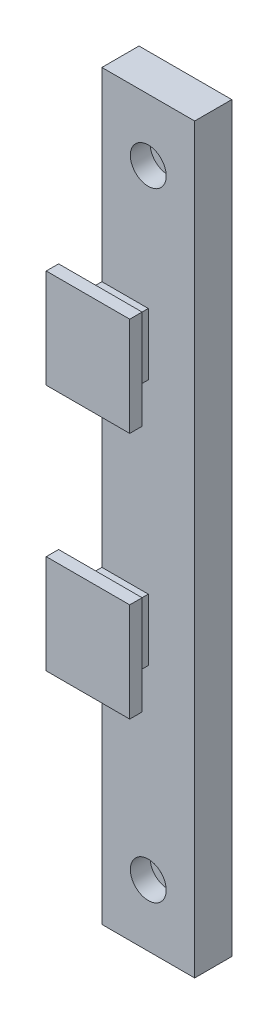
ISO-10303-21;
HEADER;
FILE_DESCRIPTION(('STEP AP214'),'2;1');
FILE_NAME('part.step','',(''),(''),'','','');
FILE_SCHEMA(('AUTOMOTIVE_DESIGN { 1 0 10303 214 1 1 1 1 }'));
ENDSEC;
DATA;
#1=APPLICATION_CONTEXT('core data for automotive mechanical design processes');
#2=APPLICATION_PROTOCOL_DEFINITION('international standard','automotive_design',2000,#1);
#3=PRODUCT_CONTEXT('',#1,'mechanical');
#4=PRODUCT('Part','Part','',(#3));
#5=PRODUCT_RELATED_PRODUCT_CATEGORY('part','',(#4));
#6=PRODUCT_DEFINITION_FORMATION('','',#4);
#7=PRODUCT_DEFINITION_CONTEXT('part definition',#1,'design');
#8=PRODUCT_DEFINITION('design','',#6,#7);
#9=PRODUCT_DEFINITION_SHAPE('','',#8);
#10=(LENGTH_UNIT() NAMED_UNIT(*) SI_UNIT(.MILLI.,.METRE.));
#11=(NAMED_UNIT(*) PLANE_ANGLE_UNIT() SI_UNIT($,.RADIAN.));
#12=(NAMED_UNIT(*) SI_UNIT($,.STERADIAN.) SOLID_ANGLE_UNIT());
#13=UNCERTAINTY_MEASURE_WITH_UNIT(LENGTH_MEASURE(1.E-05),#10,'distance_accuracy_value','');
#14=(GEOMETRIC_REPRESENTATION_CONTEXT(3) GLOBAL_UNCERTAINTY_ASSIGNED_CONTEXT((#13)) GLOBAL_UNIT_ASSIGNED_CONTEXT((#10,
#11,#12)) REPRESENTATION_CONTEXT('',''));
#15=CARTESIAN_POINT('',(0.,0.,0.));
#16=DIRECTION('',(0.,0.,1.));
#17=DIRECTION('',(1.,0.,0.));
#18=AXIS2_PLACEMENT_3D('',#15,#16,#17);
#19=CARTESIAN_POINT('',(0.,-50.,0.));
#20=DIRECTION('',(0.,0.,1.));
#21=DIRECTION('',(1.,0.,0.));
#22=AXIS2_PLACEMENT_3D('',#19,#20,#21);
#23=CYLINDRICAL_SURFACE('',#22,1.65);
#24=CARTESIAN_POINT('',(0.,-50.,0.));
#25=DIRECTION('',(0.,0.,1.));
#26=DIRECTION('',(-1.,0.,0.));
#27=AXIS2_PLACEMENT_3D('',#24,#25,#26);
#28=CIRCLE('',#27,1.65);
#29=CARTESIAN_POINT('',(-1.65,-50.,0.));
#30=VERTEX_POINT('',#29);
#31=EDGE_CURVE('E374',#30,#30,#28,.T.);
#32=ORIENTED_EDGE('',*,*,#31,.F.);
#33=EDGE_LOOP('',(#32));
#34=FACE_BOUND('',#33,.T.);
#35=CARTESIAN_POINT('',(0.,-50.,2.8));
#36=DIRECTION('',(0.,0.,1.));
#37=DIRECTION('',(1.,0.,0.));
#38=AXIS2_PLACEMENT_3D('',#35,#36,#37);
#39=CIRCLE('',#38,1.65);
#40=CARTESIAN_POINT('',(1.65,-50.,2.8));
#41=VERTEX_POINT('',#40);
#42=EDGE_CURVE('E45',#41,#41,#39,.F.);
#43=ORIENTED_EDGE('',*,*,#42,.F.);
#44=EDGE_LOOP('',(#43));
#45=FACE_BOUND('',#44,.T.);
#46=ADVANCED_FACE('F41',(#34,#45),#23,.F.);
#47=CARTESIAN_POINT('',(0.,50.,0.));
#48=DIRECTION('',(0.,0.,1.));
#49=DIRECTION('',(1.,0.,0.));
#50=AXIS2_PLACEMENT_3D('',#47,#48,#49);
#51=CYLINDRICAL_SURFACE('',#50,1.65);
#52=CARTESIAN_POINT('',(0.,50.,0.));
#53=DIRECTION('',(0.,0.,1.));
#54=DIRECTION('',(1.,0.,0.));
#55=AXIS2_PLACEMENT_3D('',#52,#53,#54);
#56=CIRCLE('',#55,1.65);
#57=CARTESIAN_POINT('',(1.65,50.,0.));
#58=VERTEX_POINT('',#57);
#59=EDGE_CURVE('E381',#58,#58,#56,.T.);
#60=ORIENTED_EDGE('',*,*,#59,.F.);
#61=EDGE_LOOP('',(#60));
#62=FACE_BOUND('',#61,.T.);
#63=CARTESIAN_POINT('',(0.,50.,2.8));
#64=DIRECTION('',(0.,0.,1.));
#65=DIRECTION('',(1.,0.,0.));
#66=AXIS2_PLACEMENT_3D('',#63,#64,#65);
#67=CIRCLE('',#66,1.65);
#68=CARTESIAN_POINT('',(1.65,50.,2.8));
#69=VERTEX_POINT('',#68);
#70=EDGE_CURVE('E333',#69,#69,#67,.F.);
#71=ORIENTED_EDGE('',*,*,#70,.F.);
#72=EDGE_LOOP('',(#71));
#73=FACE_BOUND('',#72,.T.);
#74=ADVANCED_FACE('F422',(#62,#73),#51,.F.);
#75=CARTESIAN_POINT('',(7.49999999999999,60.,6.));
#76=DIRECTION('',(-1.,0.,0.));
#77=DIRECTION('',(0.,-1.,0.));
#78=AXIS2_PLACEMENT_3D('',#75,#76,#77);
#79=PLANE('',#78);
#80=DIRECTION('',(0.,1.,0.));
#81=VECTOR('',#80,1.);
#82=CARTESIAN_POINT('',(7.49999999999999,60.,0.));
#83=LINE('',#82,#81);
#84=CARTESIAN_POINT('',(7.50000000000001,-60.,0.));
#85=VERTEX_POINT('',#84);
#86=CARTESIAN_POINT('',(7.49999999999999,60.,0.));
#87=VERTEX_POINT('',#86);
#88=EDGE_CURVE('E384',#85,#87,#83,.T.);
#89=ORIENTED_EDGE('',*,*,#88,.T.);
#90=DIRECTION('',(0.,0.,-1.));
#91=VECTOR('',#90,1.);
#92=CARTESIAN_POINT('',(7.49999999999999,60.,6.));
#93=LINE('',#92,#91);
#94=CARTESIAN_POINT('',(7.49999999999999,60.,6.));
#95=VERTEX_POINT('',#94);
#96=EDGE_CURVE('E11',#95,#87,#93,.T.);
#97=ORIENTED_EDGE('',*,*,#96,.F.);
#98=DIRECTION('',(0.,1.,0.));
#99=VECTOR('',#98,1.);
#100=CARTESIAN_POINT('',(7.49999999999999,60.,6.));
#101=LINE('',#100,#99);
#102=CARTESIAN_POINT('',(7.50000000000001,-60.,6.));
#103=VERTEX_POINT('',#102);
#104=EDGE_CURVE('E387',#103,#95,#101,.T.);
#105=ORIENTED_EDGE('',*,*,#104,.F.);
#106=DIRECTION('',(0.,0.,-1.));
#107=VECTOR('',#106,1.);
#108=CARTESIAN_POINT('',(7.50000000000001,-60.,6.));
#109=LINE('',#108,#107);
#110=EDGE_CURVE('E399',#103,#85,#109,.T.);
#111=ORIENTED_EDGE('',*,*,#110,.T.);
#112=EDGE_LOOP('',(#89,#97,#105,#111));
#113=FACE_BOUND('',#112,.T.);
#114=ADVANCED_FACE('F43',(#113),#79,.F.);
#115=CARTESIAN_POINT('',(-7.50000000000001,60.,6.));
#116=DIRECTION('',(0.,-1.,0.));
#117=DIRECTION('',(0.,0.,-1.));
#118=AXIS2_PLACEMENT_3D('',#115,#116,#117);
#119=PLANE('',#118);
#120=DIRECTION('',(-1.,0.,0.));
#121=VECTOR('',#120,1.);
#122=CARTESIAN_POINT('',(-7.50000000000001,60.,0.));
#123=LINE('',#122,#121);
#124=CARTESIAN_POINT('',(-7.50000000000001,60.,0.));
#125=VERTEX_POINT('',#124);
#126=EDGE_CURVE('E402',#87,#125,#123,.T.);
#127=ORIENTED_EDGE('',*,*,#126,.T.);
#128=DIRECTION('',(0.,0.,-1.));
#129=VECTOR('',#128,1.);
#130=CARTESIAN_POINT('',(-7.50000000000001,60.,6.));
#131=LINE('',#130,#129);
#132=CARTESIAN_POINT('',(-7.50000000000001,60.,6.));
#133=VERTEX_POINT('',#132);
#134=EDGE_CURVE('E50',#133,#125,#131,.T.);
#135=ORIENTED_EDGE('',*,*,#134,.F.);
#136=DIRECTION('',(-1.,0.,0.));
#137=VECTOR('',#136,1.);
#138=CARTESIAN_POINT('',(-7.50000000000001,60.,6.));
#139=LINE('',#138,#137);
#140=EDGE_CURVE('E390',#95,#133,#139,.T.);
#141=ORIENTED_EDGE('',*,*,#140,.F.);
#142=ORIENTED_EDGE('',*,*,#96,.T.);
#143=EDGE_LOOP('',(#127,#135,#141,#142));
#144=FACE_BOUND('',#143,.T.);
#145=ADVANCED_FACE('F448',(#144),#119,.F.);
#146=CARTESIAN_POINT('',(-7.50000000000001,60.,6.));
#147=DIRECTION('',(1.,0.,0.));
#148=DIRECTION('',(0.,1.,0.));
#149=AXIS2_PLACEMENT_3D('',#146,#147,#148);
#150=PLANE('',#149);
#151=DIRECTION('',(0.,-1.,0.));
#152=VECTOR('',#151,1.);
#153=CARTESIAN_POINT('',(-7.50000000000001,60.,0.));
#154=LINE('',#153,#152);
#155=CARTESIAN_POINT('',(-7.49999999999999,-60.,0.));
#156=VERTEX_POINT('',#155);
#157=EDGE_CURVE('E404',#125,#156,#154,.T.);
#158=ORIENTED_EDGE('',*,*,#157,.T.);
#159=DIRECTION('',(0.,0.,-1.));
#160=VECTOR('',#159,1.);
#161=CARTESIAN_POINT('',(-7.49999999999999,-60.,6.));
#162=LINE('',#161,#160);
#163=CARTESIAN_POINT('',(-7.49999999999999,-60.,6.));
#164=VERTEX_POINT('',#163);
#165=EDGE_CURVE('E409',#164,#156,#162,.T.);
#166=ORIENTED_EDGE('',*,*,#165,.F.);
#167=DIRECTION('',(0.,-1.,0.));
#168=VECTOR('',#167,1.);
#169=CARTESIAN_POINT('',(-7.50000000000001,60.,6.));
#170=LINE('',#169,#168);
#171=CARTESIAN_POINT('',(-7.5,-20.,6.));
#172=VERTEX_POINT('',#171);
#173=EDGE_CURVE('E393',#172,#164,#170,.T.);
#174=ORIENTED_EDGE('',*,*,#173,.F.);
#175=DIRECTION('',(0.,0.,-1.));
#176=VECTOR('',#175,1.);
#177=CARTESIAN_POINT('',(-7.50000000000001,-20.,10.));
#178=LINE('',#177,#176);
#179=CARTESIAN_POINT('',(-7.50000000000001,-20.,10.));
#180=VERTEX_POINT('',#179);
#181=EDGE_CURVE('E300',#180,#172,#178,.T.);
#182=ORIENTED_EDGE('',*,*,#181,.F.);
#183=DIRECTION('',(0.,-1.,0.));
#184=VECTOR('',#183,1.);
#185=CARTESIAN_POINT('',(-7.50000000000001,-20.,10.));
#186=LINE('',#185,#184);
#187=CARTESIAN_POINT('',(-7.50000000000001,-10.,10.));
#188=VERTEX_POINT('',#187);
#189=EDGE_CURVE('E273',#188,#180,#186,.T.);
#190=ORIENTED_EDGE('',*,*,#189,.F.);
#191=DIRECTION('',(0.,0.,-1.));
#192=VECTOR('',#191,1.);
#193=CARTESIAN_POINT('',(-7.50000000000001,-10.,10.));
#194=LINE('',#193,#192);
#195=CARTESIAN_POINT('',(-7.5,-10.,6.));
#196=VERTEX_POINT('',#195);
#197=EDGE_CURVE('E285',#188,#196,#194,.T.);
#198=ORIENTED_EDGE('',*,*,#197,.T.);
#199=CARTESIAN_POINT('',(-7.5,20.,6.));
#200=VERTEX_POINT('',#199);
#201=EDGE_CURVE('E397',#200,#196,#170,.T.);
#202=ORIENTED_EDGE('',*,*,#201,.F.);
#203=DIRECTION('',(0.,0.,-1.));
#204=VECTOR('',#203,1.);
#205=CARTESIAN_POINT('',(-7.50000000000001,20.,10.));
#206=LINE('',#205,#204);
#207=CARTESIAN_POINT('',(-7.50000000000001,20.,10.));
#208=VERTEX_POINT('',#207);
#209=EDGE_CURVE('E306',#208,#200,#206,.T.);
#210=ORIENTED_EDGE('',*,*,#209,.F.);
#211=DIRECTION('',(0.,-1.,0.));
#212=VECTOR('',#211,1.);
#213=CARTESIAN_POINT('',(-7.50000000000001,20.,10.));
#214=LINE('',#213,#212);
#215=CARTESIAN_POINT('',(-7.50000000000001,30.,10.));
#216=VERTEX_POINT('',#215);
#217=EDGE_CURVE('E322',#216,#208,#214,.T.);
#218=ORIENTED_EDGE('',*,*,#217,.F.);
#219=DIRECTION('',(0.,0.,-1.));
#220=VECTOR('',#219,1.);
#221=CARTESIAN_POINT('',(-7.50000000000001,30.,10.));
#222=LINE('',#221,#220);
#223=CARTESIAN_POINT('',(-7.50000000000001,30.,6.));
#224=VERTEX_POINT('',#223);
#225=EDGE_CURVE('E237',#216,#224,#222,.T.);
#226=ORIENTED_EDGE('',*,*,#225,.T.);
#227=EDGE_CURVE('E394',#133,#224,#170,.T.);
#228=ORIENTED_EDGE('',*,*,#227,.F.);
#229=ORIENTED_EDGE('',*,*,#134,.T.);
#230=EDGE_LOOP('',(#158,#166,#174,#182,#190,#198,#202,#210,#218,#226,#228,#229));
#231=FACE_BOUND('',#230,.T.);
#232=ADVANCED_FACE('F445',(#231),#150,.F.);
#233=CARTESIAN_POINT('',(-7.49999999999999,-60.,6.));
#234=DIRECTION('',(0.,1.,0.));
#235=DIRECTION('',(0.,0.,1.));
#236=AXIS2_PLACEMENT_3D('',#233,#234,#235);
#237=PLANE('',#236);
#238=DIRECTION('',(1.,0.,0.));
#239=VECTOR('',#238,1.);
#240=CARTESIAN_POINT('',(-7.49999999999999,-60.,0.));
#241=LINE('',#240,#239);
#242=EDGE_CURVE('E391',#156,#85,#241,.T.);
#243=ORIENTED_EDGE('',*,*,#242,.T.);
#244=ORIENTED_EDGE('',*,*,#110,.F.);
#245=DIRECTION('',(1.,0.,0.));
#246=VECTOR('',#245,1.);
#247=CARTESIAN_POINT('',(-7.49999999999999,-60.,6.));
#248=LINE('',#247,#246);
#249=EDGE_CURVE('E396',#164,#103,#248,.T.);
#250=ORIENTED_EDGE('',*,*,#249,.F.);
#251=ORIENTED_EDGE('',*,*,#165,.T.);
#252=EDGE_LOOP('',(#243,#244,#250,#251));
#253=FACE_BOUND('',#252,.T.);
#254=ADVANCED_FACE('F438',(#253),#237,.F.);
#255=CARTESIAN_POINT('',(0.,0.,6.));
#256=DIRECTION('',(0.,0.,1.));
#257=DIRECTION('',(1.,0.,0.));
#258=AXIS2_PLACEMENT_3D('',#255,#256,#257);
#259=PLANE('',#258);
#260=DIRECTION('',(-1.,0.,0.));
#261=VECTOR('',#260,1.);
#262=CARTESIAN_POINT('',(-7.50000000000001,-10.,6.));
#263=LINE('',#262,#261);
#264=CARTESIAN_POINT('',(0.,-10.,6.));
#265=VERTEX_POINT('',#264);
#266=EDGE_CURVE('E58',#265,#196,#263,.T.);
#267=ORIENTED_EDGE('',*,*,#266,.F.);
#268=DIRECTION('',(0.,1.,0.));
#269=VECTOR('',#268,1.);
#270=CARTESIAN_POINT('',(0.,-20.,6.));
#271=LINE('',#270,#269);
#272=CARTESIAN_POINT('',(0.,-20.,6.));
#273=VERTEX_POINT('',#272);
#274=EDGE_CURVE('E289',#273,#265,#271,.T.);
#275=ORIENTED_EDGE('',*,*,#274,.F.);
#276=DIRECTION('',(1.,0.,0.));
#277=VECTOR('',#276,1.);
#278=CARTESIAN_POINT('',(-7.50000000000001,-20.,6.));
#279=LINE('',#278,#277);
#280=EDGE_CURVE('E286',#172,#273,#279,.T.);
#281=ORIENTED_EDGE('',*,*,#280,.F.);
#282=ORIENTED_EDGE('',*,*,#173,.T.);
#283=ORIENTED_EDGE('',*,*,#249,.T.);
#284=ORIENTED_EDGE('',*,*,#104,.T.);
#285=ORIENTED_EDGE('',*,*,#140,.T.);
#286=ORIENTED_EDGE('',*,*,#227,.T.);
#287=DIRECTION('',(-1.,0.,0.));
#288=VECTOR('',#287,1.);
#289=CARTESIAN_POINT('',(0.,30.,6.));
#290=LINE('',#289,#288);
#291=CARTESIAN_POINT('',(0.,30.,6.));
#292=VERTEX_POINT('',#291);
#293=EDGE_CURVE('E315',#292,#224,#290,.T.);
#294=ORIENTED_EDGE('',*,*,#293,.F.);
#295=DIRECTION('',(0.,1.,0.));
#296=VECTOR('',#295,1.);
#297=CARTESIAN_POINT('',(0.,20.,6.));
#298=LINE('',#297,#296);
#299=CARTESIAN_POINT('',(0.,20.,6.));
#300=VERTEX_POINT('',#299);
#301=EDGE_CURVE('E65',#300,#292,#298,.T.);
#302=ORIENTED_EDGE('',*,*,#301,.F.);
#303=DIRECTION('',(1.,0.,0.));
#304=VECTOR('',#303,1.);
#305=CARTESIAN_POINT('',(0.,20.,6.));
#306=LINE('',#305,#304);
#307=EDGE_CURVE('E313',#200,#300,#306,.T.);
#308=ORIENTED_EDGE('',*,*,#307,.F.);
#309=ORIENTED_EDGE('',*,*,#201,.T.);
#310=EDGE_LOOP('',(#267,#275,#281,#282,#283,#284,#285,#286,#294,#302,#308,#309));
#311=FACE_BOUND('',#310,.T.);
#312=CARTESIAN_POINT('',(0.,50.,6.));
#313=DIRECTION('',(0.,0.,1.));
#314=DIRECTION('',(1.,0.,0.));
#315=AXIS2_PLACEMENT_3D('',#312,#313,#314);
#316=CIRCLE('',#315,2.9);
#317=CARTESIAN_POINT('',(2.9,50.,6.));
#318=VERTEX_POINT('',#317);
#319=EDGE_CURVE('E334',#318,#318,#316,.T.);
#320=ORIENTED_EDGE('',*,*,#319,.F.);
#321=EDGE_LOOP('',(#320));
#322=FACE_BOUND('',#321,.T.);
#323=CARTESIAN_POINT('',(0.,-50.,6.));
#324=DIRECTION('',(0.,0.,1.));
#325=DIRECTION('',(1.,0.,0.));
#326=AXIS2_PLACEMENT_3D('',#323,#324,#325);
#327=CIRCLE('',#326,2.9);
#328=CARTESIAN_POINT('',(2.9,-50.,6.));
#329=VERTEX_POINT('',#328);
#330=EDGE_CURVE('E337',#329,#329,#327,.T.);
#331=ORIENTED_EDGE('',*,*,#330,.F.);
#332=EDGE_LOOP('',(#331));
#333=FACE_BOUND('',#332,.T.);
#334=ADVANCED_FACE('F434',(#311,#322,#333),#259,.T.);
#335=CARTESIAN_POINT('',(0.,0.,0.));
#336=DIRECTION('',(0.,0.,1.));
#337=DIRECTION('',(1.,0.,0.));
#338=AXIS2_PLACEMENT_3D('',#335,#336,#337);
#339=PLANE('',#338);
#340=DIRECTION('',(0.,-1.,0.));
#341=VECTOR('',#340,1.);
#342=CARTESIAN_POINT('',(2.89999999999999,2.46,0.));
#343=LINE('',#342,#341);
#344=CARTESIAN_POINT('',(2.89999999999999,2.46,0.));
#345=VERTEX_POINT('',#344);
#346=CARTESIAN_POINT('',(2.89999999999999,-13.34,0.));
#347=VERTEX_POINT('',#346);
#348=EDGE_CURVE('E353',#345,#347,#343,.T.);
#349=ORIENTED_EDGE('',*,*,#348,.F.);
#350=DIRECTION('',(0.707106781186551,-0.707106781186544,0.));
#351=VECTOR('',#350,1.);
#352=CARTESIAN_POINT('',(2.89999999999999,2.46,0.));
#353=LINE('',#352,#351);
#354=CARTESIAN_POINT('',(0.,5.35999999999997,0.));
#355=VERTEX_POINT('',#354);
#356=EDGE_CURVE('E349',#355,#345,#353,.T.);
#357=ORIENTED_EDGE('',*,*,#356,.F.);
#358=DIRECTION('',(0.707106781186553,0.707106781186542,0.));
#359=VECTOR('',#358,1.);
#360=CARTESIAN_POINT('',(0.,5.35999999999997,0.));
#361=LINE('',#360,#359);
#362=CARTESIAN_POINT('',(-2.90000000000001,2.46,0.));
#363=VERTEX_POINT('',#362);
#364=EDGE_CURVE('E346',#363,#355,#361,.T.);
#365=ORIENTED_EDGE('',*,*,#364,.F.);
#366=DIRECTION('',(0.,1.,0.));
#367=VECTOR('',#366,1.);
#368=CARTESIAN_POINT('',(-2.90000000000001,2.46,0.));
#369=LINE('',#368,#367);
#370=CARTESIAN_POINT('',(-2.90000000000001,-13.34,0.));
#371=VERTEX_POINT('',#370);
#372=EDGE_CURVE('E358',#371,#363,#369,.T.);
#373=ORIENTED_EDGE('',*,*,#372,.F.);
#374=DIRECTION('',(-1.,0.,0.));
#375=VECTOR('',#374,1.);
#376=CARTESIAN_POINT('',(2.89999999999999,-13.34,0.));
#377=LINE('',#376,#375);
#378=EDGE_CURVE('E366',#347,#371,#377,.T.);
#379=ORIENTED_EDGE('',*,*,#378,.F.);
#380=EDGE_LOOP('',(#349,#357,#365,#373,#379));
#381=FACE_BOUND('',#380,.T.);
#382=ORIENTED_EDGE('',*,*,#59,.T.);
#383=EDGE_LOOP('',(#382));
#384=FACE_BOUND('',#383,.T.);
#385=ORIENTED_EDGE('',*,*,#31,.T.);
#386=EDGE_LOOP('',(#385));
#387=FACE_BOUND('',#386,.T.);
#388=ORIENTED_EDGE('',*,*,#88,.F.);
#389=ORIENTED_EDGE('',*,*,#242,.F.);
#390=ORIENTED_EDGE('',*,*,#157,.F.);
#391=ORIENTED_EDGE('',*,*,#126,.F.);
#392=EDGE_LOOP('',(#388,#389,#390,#391));
#393=FACE_BOUND('',#392,.T.);
#394=ADVANCED_FACE('F437',(#381,#384,#387,#393),#339,.F.);
#395=CARTESIAN_POINT('',(2.89999999999999,2.46,3.1));
#396=DIRECTION('',(1.,0.,0.));
#397=DIRECTION('',(0.,1.,0.));
#398=AXIS2_PLACEMENT_3D('',#395,#396,#397);
#399=PLANE('',#398);
#400=ORIENTED_EDGE('',*,*,#348,.T.);
#401=DIRECTION('',(0.,0.,-1.));
#402=VECTOR('',#401,1.);
#403=CARTESIAN_POINT('',(2.89999999999999,-13.34,3.1));
#404=LINE('',#403,#402);
#405=CARTESIAN_POINT('',(2.89999999999999,-13.34,3.1));
#406=VERTEX_POINT('',#405);
#407=EDGE_CURVE('E364',#406,#347,#404,.T.);
#408=ORIENTED_EDGE('',*,*,#407,.F.);
#409=DIRECTION('',(0.,-1.,0.));
#410=VECTOR('',#409,1.);
#411=CARTESIAN_POINT('',(2.89999999999999,2.46,3.1));
#412=LINE('',#411,#410);
#413=CARTESIAN_POINT('',(2.89999999999999,2.46,3.1));
#414=VERTEX_POINT('',#413);
#415=EDGE_CURVE('E354',#414,#406,#412,.T.);
#416=ORIENTED_EDGE('',*,*,#415,.F.);
#417=DIRECTION('',(0.,0.,-1.));
#418=VECTOR('',#417,1.);
#419=CARTESIAN_POINT('',(2.89999999999999,2.46,3.1));
#420=LINE('',#419,#418);
#421=EDGE_CURVE('E371',#414,#345,#420,.T.);
#422=ORIENTED_EDGE('',*,*,#421,.T.);
#423=EDGE_LOOP('',(#400,#408,#416,#422));
#424=FACE_BOUND('',#423,.T.);
#425=ADVANCED_FACE('F441',(#424),#399,.F.);
#426=CARTESIAN_POINT('',(-2.90000000000001,2.46,3.1));
#427=DIRECTION('',(-1.,0.,0.));
#428=DIRECTION('',(0.,-1.,0.));
#429=AXIS2_PLACEMENT_3D('',#426,#427,#428);
#430=PLANE('',#429);
#431=ORIENTED_EDGE('',*,*,#372,.T.);
#432=DIRECTION('',(0.,0.,-1.));
#433=VECTOR('',#432,1.);
#434=CARTESIAN_POINT('',(-2.90000000000001,2.46,3.1));
#435=LINE('',#434,#433);
#436=CARTESIAN_POINT('',(-2.90000000000001,2.46,3.1));
#437=VERTEX_POINT('',#436);
#438=EDGE_CURVE('E375',#437,#363,#435,.T.);
#439=ORIENTED_EDGE('',*,*,#438,.F.);
#440=DIRECTION('',(0.,1.,0.));
#441=VECTOR('',#440,1.);
#442=CARTESIAN_POINT('',(-2.90000000000001,2.46,3.1));
#443=LINE('',#442,#441);
#444=CARTESIAN_POINT('',(-2.90000000000001,-13.34,3.1));
#445=VERTEX_POINT('',#444);
#446=EDGE_CURVE('E361',#445,#437,#443,.T.);
#447=ORIENTED_EDGE('',*,*,#446,.F.);
#448=DIRECTION('',(0.,0.,-1.));
#449=VECTOR('',#448,1.);
#450=CARTESIAN_POINT('',(-2.90000000000001,-13.34,3.1));
#451=LINE('',#450,#449);
#452=EDGE_CURVE('E377',#445,#371,#451,.T.);
#453=ORIENTED_EDGE('',*,*,#452,.T.);
#454=EDGE_LOOP('',(#431,#439,#447,#453));
#455=FACE_BOUND('',#454,.T.);
#456=ADVANCED_FACE('F529',(#455),#430,.F.);
#457=CARTESIAN_POINT('',(2.89999999999999,-13.34,3.1));
#458=DIRECTION('',(0.,-1.,0.));
#459=DIRECTION('',(0.,0.,-1.));
#460=AXIS2_PLACEMENT_3D('',#457,#458,#459);
#461=PLANE('',#460);
#462=ORIENTED_EDGE('',*,*,#378,.T.);
#463=ORIENTED_EDGE('',*,*,#452,.F.);
#464=DIRECTION('',(-1.,0.,0.));
#465=VECTOR('',#464,1.);
#466=CARTESIAN_POINT('',(2.89999999999999,-13.34,3.1));
#467=LINE('',#466,#465);
#468=EDGE_CURVE('E357',#406,#445,#467,.T.);
#469=ORIENTED_EDGE('',*,*,#468,.F.);
#470=ORIENTED_EDGE('',*,*,#407,.T.);
#471=EDGE_LOOP('',(#462,#463,#469,#470));
#472=FACE_BOUND('',#471,.T.);
#473=ADVANCED_FACE('F527',(#472),#461,.F.);
#474=CARTESIAN_POINT('',(0.,0.,3.1));
#475=DIRECTION('',(0.,0.,-1.));
#476=DIRECTION('',(-1.,0.,0.));
#477=AXIS2_PLACEMENT_3D('',#474,#475,#476);
#478=PLANE('',#477);
#479=ORIENTED_EDGE('',*,*,#415,.T.);
#480=ORIENTED_EDGE('',*,*,#468,.T.);
#481=ORIENTED_EDGE('',*,*,#446,.T.);
#482=DIRECTION('',(-0.707106781186553,-0.707106781186542,0.));
#483=VECTOR('',#482,1.);
#484=CARTESIAN_POINT('',(0.,5.35999999999997,3.1));
#485=LINE('',#484,#483);
#486=CARTESIAN_POINT('',(0.,5.35999999999997,3.1));
#487=VERTEX_POINT('',#486);
#488=EDGE_CURVE('E344',#487,#437,#485,.T.);
#489=ORIENTED_EDGE('',*,*,#488,.F.);
#490=DIRECTION('',(-0.707106781186551,0.707106781186544,0.));
#491=VECTOR('',#490,1.);
#492=CARTESIAN_POINT('',(2.89999999999999,2.46,3.1));
#493=LINE('',#492,#491);
#494=EDGE_CURVE('E342',#414,#487,#493,.T.);
#495=ORIENTED_EDGE('',*,*,#494,.F.);
#496=EDGE_LOOP('',(#479,#480,#481,#489,#495));
#497=FACE_BOUND('',#496,.T.);
#498=ADVANCED_FACE('F521',(#497),#478,.T.);
#499=CARTESIAN_POINT('',(2.89999999999999,2.46,9.58459713474937));
#500=DIRECTION('',(0.707106781186544,0.707106781186551,0.));
#501=DIRECTION('',(-0.707106781186551,0.707106781186544,0.));
#502=AXIS2_PLACEMENT_3D('',#499,#500,#501);
#503=PLANE('',#502);
#504=ORIENTED_EDGE('',*,*,#494,.T.);
#505=DIRECTION('',(0.,0.,-1.));
#506=VECTOR('',#505,1.);
#507=CARTESIAN_POINT('',(0.,5.35999999999997,9.58459713474937));
#508=LINE('',#507,#506);
#509=EDGE_CURVE('E345',#487,#355,#508,.T.);
#510=ORIENTED_EDGE('',*,*,#509,.T.);
#511=ORIENTED_EDGE('',*,*,#356,.T.);
#512=ORIENTED_EDGE('',*,*,#421,.F.);
#513=EDGE_LOOP('',(#504,#510,#511,#512));
#514=FACE_BOUND('',#513,.T.);
#515=ADVANCED_FACE('F518',(#514),#503,.F.);
#516=CARTESIAN_POINT('',(0.,5.35999999999997,9.58459713474937));
#517=DIRECTION('',(-0.707106781186542,0.707106781186553,0.));
#518=DIRECTION('',(-0.707106781186553,-0.707106781186542,0.));
#519=AXIS2_PLACEMENT_3D('',#516,#517,#518);
#520=PLANE('',#519);
#521=ORIENTED_EDGE('',*,*,#488,.T.);
#522=ORIENTED_EDGE('',*,*,#438,.T.);
#523=ORIENTED_EDGE('',*,*,#364,.T.);
#524=ORIENTED_EDGE('',*,*,#509,.F.);
#525=EDGE_LOOP('',(#521,#522,#523,#524));
#526=FACE_BOUND('',#525,.T.);
#527=ADVANCED_FACE('F507',(#526),#520,.F.);
#528=CARTESIAN_POINT('',(0.,50.,2.8));
#529=DIRECTION('',(0.,0.,1.));
#530=DIRECTION('',(1.,0.,0.));
#531=AXIS2_PLACEMENT_3D('',#528,#529,#530);
#532=PLANE('',#531);
#533=CARTESIAN_POINT('',(0.,50.,2.8));
#534=DIRECTION('',(0.,0.,1.));
#535=DIRECTION('',(1.,0.,0.));
#536=AXIS2_PLACEMENT_3D('',#533,#534,#535);
#537=CIRCLE('',#536,2.9);
#538=CARTESIAN_POINT('',(2.9,50.,2.8));
#539=VERTEX_POINT('',#538);
#540=EDGE_CURVE('E330',#539,#539,#537,.T.);
#541=ORIENTED_EDGE('',*,*,#540,.T.);
#542=EDGE_LOOP('',(#541));
#543=FACE_BOUND('',#542,.T.);
#544=ORIENTED_EDGE('',*,*,#70,.T.);
#545=EDGE_LOOP('',(#544));
#546=FACE_BOUND('',#545,.T.);
#547=ADVANCED_FACE('F503',(#543,#546),#532,.T.);
#548=CARTESIAN_POINT('',(0.,50.,2.8));
#549=DIRECTION('',(0.,0.,1.));
#550=DIRECTION('',(1.,0.,0.));
#551=AXIS2_PLACEMENT_3D('',#548,#549,#550);
#552=CYLINDRICAL_SURFACE('',#551,2.9);
#553=ORIENTED_EDGE('',*,*,#540,.F.);
#554=EDGE_LOOP('',(#553));
#555=FACE_BOUND('',#554,.T.);
#556=ORIENTED_EDGE('',*,*,#319,.T.);
#557=EDGE_LOOP('',(#556));
#558=FACE_BOUND('',#557,.T.);
#559=ADVANCED_FACE('F506',(#555,#558),#552,.F.);
#560=CARTESIAN_POINT('',(0.,-50.,2.8));
#561=DIRECTION('',(0.,0.,1.));
#562=DIRECTION('',(1.,0.,0.));
#563=AXIS2_PLACEMENT_3D('',#560,#561,#562);
#564=PLANE('',#563);
#565=CARTESIAN_POINT('',(0.,-50.,2.8));
#566=DIRECTION('',(0.,0.,1.));
#567=DIRECTION('',(1.,0.,0.));
#568=AXIS2_PLACEMENT_3D('',#565,#566,#567);
#569=CIRCLE('',#568,2.9);
#570=CARTESIAN_POINT('',(2.9,-50.,2.8));
#571=VERTEX_POINT('',#570);
#572=EDGE_CURVE('E302',#571,#571,#569,.T.);
#573=ORIENTED_EDGE('',*,*,#572,.T.);
#574=EDGE_LOOP('',(#573));
#575=FACE_BOUND('',#574,.T.);
#576=ORIENTED_EDGE('',*,*,#42,.T.);
#577=EDGE_LOOP('',(#576));
#578=FACE_BOUND('',#577,.T.);
#579=ADVANCED_FACE('F419',(#575,#578),#564,.T.);
#580=CARTESIAN_POINT('',(0.,-50.,2.8));
#581=DIRECTION('',(0.,0.,1.));
#582=DIRECTION('',(1.,0.,0.));
#583=AXIS2_PLACEMENT_3D('',#580,#581,#582);
#584=CYLINDRICAL_SURFACE('',#583,2.9);
#585=ORIENTED_EDGE('',*,*,#572,.F.);
#586=EDGE_LOOP('',(#585));
#587=FACE_BOUND('',#586,.T.);
#588=ORIENTED_EDGE('',*,*,#330,.T.);
#589=EDGE_LOOP('',(#588));
#590=FACE_BOUND('',#589,.T.);
#591=ADVANCED_FACE('F498',(#587,#590),#584,.F.);
#592=CARTESIAN_POINT('',(0.,20.,10.));
#593=DIRECTION('',(-1.,0.,0.));
#594=DIRECTION('',(0.,0.,1.));
#595=AXIS2_PLACEMENT_3D('',#592,#593,#594);
#596=PLANE('',#595);
#597=ORIENTED_EDGE('',*,*,#301,.T.);
#598=DIRECTION('',(0.,0.,-1.));
#599=VECTOR('',#598,1.);
#600=CARTESIAN_POINT('',(0.,30.,10.));
#601=LINE('',#600,#599);
#602=CARTESIAN_POINT('',(0.,30.,10.));
#603=VERTEX_POINT('',#602);
#604=EDGE_CURVE('E234',#603,#292,#601,.T.);
#605=ORIENTED_EDGE('',*,*,#604,.F.);
#606=DIRECTION('',(0.,1.,0.));
#607=VECTOR('',#606,1.);
#608=CARTESIAN_POINT('',(0.,20.,10.));
#609=LINE('',#608,#607);
#610=CARTESIAN_POINT('',(0.,20.,10.));
#611=VERTEX_POINT('',#610);
#612=EDGE_CURVE('E316',#611,#603,#609,.T.);
#613=ORIENTED_EDGE('',*,*,#612,.F.);
#614=DIRECTION('',(0.,0.,-1.));
#615=VECTOR('',#614,1.);
#616=CARTESIAN_POINT('',(0.,20.,10.));
#617=LINE('',#616,#615);
#618=EDGE_CURVE('E309',#611,#300,#617,.T.);
#619=ORIENTED_EDGE('',*,*,#618,.T.);
#620=EDGE_LOOP('',(#597,#605,#613,#619));
#621=FACE_BOUND('',#620,.T.);
#622=ADVANCED_FACE('F495',(#621),#596,.F.);
#623=CARTESIAN_POINT('',(0.,30.,10.));
#624=DIRECTION('',(0.,-1.,0.));
#625=DIRECTION('',(0.,0.,-1.));
#626=AXIS2_PLACEMENT_3D('',#623,#624,#625);
#627=PLANE('',#626);
#628=ORIENTED_EDGE('',*,*,#293,.T.);
#629=ORIENTED_EDGE('',*,*,#225,.F.);
#630=DIRECTION('',(-1.,0.,0.));
#631=VECTOR('',#630,1.);
#632=CARTESIAN_POINT('',(0.,30.,10.));
#633=LINE('',#632,#631);
#634=EDGE_CURVE('E325',#603,#216,#633,.T.);
#635=ORIENTED_EDGE('',*,*,#634,.F.);
#636=ORIENTED_EDGE('',*,*,#604,.T.);
#637=EDGE_LOOP('',(#628,#629,#635,#636));
#638=FACE_BOUND('',#637,.T.);
#639=ADVANCED_FACE('F490',(#638),#627,.F.);
#640=CARTESIAN_POINT('',(0.,20.,10.));
#641=DIRECTION('',(0.,1.,0.));
#642=DIRECTION('',(0.,0.,1.));
#643=AXIS2_PLACEMENT_3D('',#640,#641,#642);
#644=PLANE('',#643);
#645=ORIENTED_EDGE('',*,*,#307,.T.);
#646=ORIENTED_EDGE('',*,*,#618,.F.);
#647=DIRECTION('',(1.,0.,0.));
#648=VECTOR('',#647,1.);
#649=CARTESIAN_POINT('',(0.,20.,10.));
#650=LINE('',#649,#648);
#651=EDGE_CURVE('E312',#208,#611,#650,.T.);
#652=ORIENTED_EDGE('',*,*,#651,.F.);
#653=ORIENTED_EDGE('',*,*,#209,.T.);
#654=EDGE_LOOP('',(#645,#646,#652,#653));
#655=FACE_BOUND('',#654,.T.);
#656=ADVANCED_FACE('F483',(#655),#644,.F.);
#657=CARTESIAN_POINT('',(-7.50000000000001,-20.,10.));
#658=DIRECTION('',(0.,1.,0.));
#659=DIRECTION('',(0.,0.,1.));
#660=AXIS2_PLACEMENT_3D('',#657,#658,#659);
#661=PLANE('',#660);
#662=ORIENTED_EDGE('',*,*,#280,.T.);
#663=DIRECTION('',(0.,0.,-1.));
#664=VECTOR('',#663,1.);
#665=CARTESIAN_POINT('',(0.,-20.,10.));
#666=LINE('',#665,#664);
#667=CARTESIAN_POINT('',(0.,-20.,10.));
#668=VERTEX_POINT('',#667);
#669=EDGE_CURVE('E297',#668,#273,#666,.T.);
#670=ORIENTED_EDGE('',*,*,#669,.F.);
#671=DIRECTION('',(1.,0.,0.));
#672=VECTOR('',#671,1.);
#673=CARTESIAN_POINT('',(-7.50000000000001,-20.,10.));
#674=LINE('',#673,#672);
#675=EDGE_CURVE('E276',#180,#668,#674,.T.);
#676=ORIENTED_EDGE('',*,*,#675,.F.);
#677=ORIENTED_EDGE('',*,*,#181,.T.);
#678=EDGE_LOOP('',(#662,#670,#676,#677));
#679=FACE_BOUND('',#678,.T.);
#680=ADVANCED_FACE('F481',(#679),#661,.F.);
#681=CARTESIAN_POINT('',(0.,-20.,10.));
#682=DIRECTION('',(-1.,0.,0.));
#683=DIRECTION('',(0.,0.,1.));
#684=AXIS2_PLACEMENT_3D('',#681,#682,#683);
#685=PLANE('',#684);
#686=ORIENTED_EDGE('',*,*,#274,.T.);
#687=DIRECTION('',(0.,0.,-1.));
#688=VECTOR('',#687,1.);
#689=CARTESIAN_POINT('',(0.,-10.,10.));
#690=LINE('',#689,#688);
#691=CARTESIAN_POINT('',(0.,-10.,10.));
#692=VERTEX_POINT('',#691);
#693=EDGE_CURVE('E294',#692,#265,#690,.T.);
#694=ORIENTED_EDGE('',*,*,#693,.F.);
#695=DIRECTION('',(0.,1.,0.));
#696=VECTOR('',#695,1.);
#697=CARTESIAN_POINT('',(0.,-20.,10.));
#698=LINE('',#697,#696);
#699=EDGE_CURVE('E279',#668,#692,#698,.T.);
#700=ORIENTED_EDGE('',*,*,#699,.F.);
#701=ORIENTED_EDGE('',*,*,#669,.T.);
#702=EDGE_LOOP('',(#686,#694,#700,#701));
#703=FACE_BOUND('',#702,.T.);
#704=ADVANCED_FACE('F479',(#703),#685,.F.);
#705=CARTESIAN_POINT('',(-7.50000000000001,-10.,10.));
#706=DIRECTION('',(0.,-1.,0.));
#707=DIRECTION('',(0.,0.,-1.));
#708=AXIS2_PLACEMENT_3D('',#705,#706,#707);
#709=PLANE('',#708);
#710=ORIENTED_EDGE('',*,*,#266,.T.);
#711=ORIENTED_EDGE('',*,*,#197,.F.);
#712=DIRECTION('',(-1.,0.,0.));
#713=VECTOR('',#712,1.);
#714=CARTESIAN_POINT('',(-7.50000000000001,-10.,10.));
#715=LINE('',#714,#713);
#716=EDGE_CURVE('E282',#692,#188,#715,.T.);
#717=ORIENTED_EDGE('',*,*,#716,.F.);
#718=ORIENTED_EDGE('',*,*,#693,.T.);
#719=EDGE_LOOP('',(#710,#711,#717,#718));
#720=FACE_BOUND('',#719,.T.);
#721=ADVANCED_FACE('F473',(#720),#709,.F.);
#722=CARTESIAN_POINT('',(0.,0.,10.));
#723=DIRECTION('',(0.,0.,1.));
#724=DIRECTION('',(1.,0.,0.));
#725=AXIS2_PLACEMENT_3D('',#722,#723,#724);
#726=PLANE('',#725);
#727=DIRECTION('',(-1.,0.,0.));
#728=VECTOR('',#727,1.);
#729=CARTESIAN_POINT('',(3.,-7.,10.));
#730=LINE('',#729,#728);
#731=CARTESIAN_POINT('',(3.,-7.,10.));
#732=VERTEX_POINT('',#731);
#733=CARTESIAN_POINT('',(-10.5,-7.,10.));
#734=VERTEX_POINT('',#733);
#735=EDGE_CURVE('E263',#732,#734,#730,.T.);
#736=ORIENTED_EDGE('',*,*,#735,.F.);
#737=DIRECTION('',(0.,1.,0.));
#738=VECTOR('',#737,1.);
#739=CARTESIAN_POINT('',(3.,-23.,10.));
#740=LINE('',#739,#738);
#741=CARTESIAN_POINT('',(3.,-23.,10.));
#742=VERTEX_POINT('',#741);
#743=EDGE_CURVE('E256',#742,#732,#740,.T.);
#744=ORIENTED_EDGE('',*,*,#743,.F.);
#745=DIRECTION('',(1.,0.,0.));
#746=VECTOR('',#745,1.);
#747=CARTESIAN_POINT('',(-10.5,-23.,10.));
#748=LINE('',#747,#746);
#749=CARTESIAN_POINT('',(-10.5,-23.,10.));
#750=VERTEX_POINT('',#749);
#751=EDGE_CURVE('E258',#750,#742,#748,.T.);
#752=ORIENTED_EDGE('',*,*,#751,.F.);
#753=DIRECTION('',(0.,-1.,0.));
#754=VECTOR('',#753,1.);
#755=CARTESIAN_POINT('',(-10.5,-7.,10.));
#756=LINE('',#755,#754);
#757=EDGE_CURVE('E261',#734,#750,#756,.T.);
#758=ORIENTED_EDGE('',*,*,#757,.F.);
#759=EDGE_LOOP('',(#736,#744,#752,#758));
#760=FACE_BOUND('',#759,.T.);
#761=ORIENTED_EDGE('',*,*,#716,.T.);
#762=ORIENTED_EDGE('',*,*,#189,.T.);
#763=ORIENTED_EDGE('',*,*,#675,.T.);
#764=ORIENTED_EDGE('',*,*,#699,.T.);
#765=EDGE_LOOP('',(#761,#762,#763,#764));
#766=FACE_BOUND('',#765,.T.);
#767=ADVANCED_FACE('F476',(#760,#766),#726,.F.);
#768=CARTESIAN_POINT('',(3.,-7.,12.));
#769=DIRECTION('',(0.,-1.,0.));
#770=DIRECTION('',(0.,0.,-1.));
#771=AXIS2_PLACEMENT_3D('',#768,#769,#770);
#772=PLANE('',#771);
#773=ORIENTED_EDGE('',*,*,#735,.T.);
#774=DIRECTION('',(0.,0.,-1.));
#775=VECTOR('',#774,1.);
#776=CARTESIAN_POINT('',(-10.5,-7.,12.));
#777=LINE('',#776,#775);
#778=CARTESIAN_POINT('',(-10.5,-7.,12.));
#779=VERTEX_POINT('',#778);
#780=EDGE_CURVE('E243',#779,#734,#777,.T.);
#781=ORIENTED_EDGE('',*,*,#780,.F.);
#782=DIRECTION('',(-1.,0.,0.));
#783=VECTOR('',#782,1.);
#784=CARTESIAN_POINT('',(3.,-7.,12.));
#785=LINE('',#784,#783);
#786=CARTESIAN_POINT('',(3.,-7.,12.));
#787=VERTEX_POINT('',#786);
#788=EDGE_CURVE('E259',#787,#779,#785,.T.);
#789=ORIENTED_EDGE('',*,*,#788,.F.);
#790=DIRECTION('',(0.,0.,-1.));
#791=VECTOR('',#790,1.);
#792=CARTESIAN_POINT('',(3.,-7.,12.));
#793=LINE('',#792,#791);
#794=EDGE_CURVE('E252',#787,#732,#793,.T.);
#795=ORIENTED_EDGE('',*,*,#794,.T.);
#796=EDGE_LOOP('',(#773,#781,#789,#795));
#797=FACE_BOUND('',#796,.T.);
#798=ADVANCED_FACE('F668',(#797),#772,.F.);
#799=CARTESIAN_POINT('',(-10.5,-7.,12.));
#800=DIRECTION('',(1.,0.,0.));
#801=DIRECTION('',(0.,0.,-1.));
#802=AXIS2_PLACEMENT_3D('',#799,#800,#801);
#803=PLANE('',#802);
#804=ORIENTED_EDGE('',*,*,#757,.T.);
#805=DIRECTION('',(0.,0.,-1.));
#806=VECTOR('',#805,1.);
#807=CARTESIAN_POINT('',(-10.5,-23.,12.));
#808=LINE('',#807,#806);
#809=CARTESIAN_POINT('',(-10.5,-23.,12.));
#810=VERTEX_POINT('',#809);
#811=EDGE_CURVE('E246',#810,#750,#808,.T.);
#812=ORIENTED_EDGE('',*,*,#811,.F.);
#813=DIRECTION('',(0.,-1.,0.));
#814=VECTOR('',#813,1.);
#815=CARTESIAN_POINT('',(-10.5,-7.,12.));
#816=LINE('',#815,#814);
#817=EDGE_CURVE('E269',#779,#810,#816,.T.);
#818=ORIENTED_EDGE('',*,*,#817,.F.);
#819=ORIENTED_EDGE('',*,*,#780,.T.);
#820=EDGE_LOOP('',(#804,#812,#818,#819));
#821=FACE_BOUND('',#820,.T.);
#822=ADVANCED_FACE('F678',(#821),#803,.F.);
#823=CARTESIAN_POINT('',(-10.5,-23.,12.));
#824=DIRECTION('',(0.,1.,0.));
#825=DIRECTION('',(0.,0.,1.));
#826=AXIS2_PLACEMENT_3D('',#823,#824,#825);
#827=PLANE('',#826);
#828=ORIENTED_EDGE('',*,*,#751,.T.);
#829=DIRECTION('',(0.,0.,-1.));
#830=VECTOR('',#829,1.);
#831=CARTESIAN_POINT('',(3.,-23.,12.));
#832=LINE('',#831,#830);
#833=CARTESIAN_POINT('',(3.,-23.,12.));
#834=VERTEX_POINT('',#833);
#835=EDGE_CURVE('E249',#834,#742,#832,.T.);
#836=ORIENTED_EDGE('',*,*,#835,.F.);
#837=DIRECTION('',(1.,0.,0.));
#838=VECTOR('',#837,1.);
#839=CARTESIAN_POINT('',(-10.5,-23.,12.));
#840=LINE('',#839,#838);
#841=EDGE_CURVE('E267',#810,#834,#840,.T.);
#842=ORIENTED_EDGE('',*,*,#841,.F.);
#843=ORIENTED_EDGE('',*,*,#811,.T.);
#844=EDGE_LOOP('',(#828,#836,#842,#843));
#845=FACE_BOUND('',#844,.T.);
#846=ADVANCED_FACE('F688',(#845),#827,.F.);
#847=CARTESIAN_POINT('',(3.,-23.,12.));
#848=DIRECTION('',(-1.,0.,0.));
#849=DIRECTION('',(0.,0.,1.));
#850=AXIS2_PLACEMENT_3D('',#847,#848,#849);
#851=PLANE('',#850);
#852=ORIENTED_EDGE('',*,*,#743,.T.);
#853=ORIENTED_EDGE('',*,*,#794,.F.);
#854=DIRECTION('',(0.,1.,0.));
#855=VECTOR('',#854,1.);
#856=CARTESIAN_POINT('',(3.,-23.,12.));
#857=LINE('',#856,#855);
#858=EDGE_CURVE('E255',#834,#787,#857,.T.);
#859=ORIENTED_EDGE('',*,*,#858,.F.);
#860=ORIENTED_EDGE('',*,*,#835,.T.);
#861=EDGE_LOOP('',(#852,#853,#859,#860));
#862=FACE_BOUND('',#861,.T.);
#863=ADVANCED_FACE('F698',(#862),#851,.F.);
#864=CARTESIAN_POINT('',(0.,0.,12.));
#865=DIRECTION('',(0.,0.,1.));
#866=DIRECTION('',(1.,0.,0.));
#867=AXIS2_PLACEMENT_3D('',#864,#865,#866);
#868=PLANE('',#867);
#869=ORIENTED_EDGE('',*,*,#788,.T.);
#870=ORIENTED_EDGE('',*,*,#817,.T.);
#871=ORIENTED_EDGE('',*,*,#841,.T.);
#872=ORIENTED_EDGE('',*,*,#858,.T.);
#873=EDGE_LOOP('',(#869,#870,#871,#872));
#874=FACE_BOUND('',#873,.T.);
#875=ADVANCED_FACE('F708',(#874),#868,.T.);
#876=CARTESIAN_POINT('',(0.,0.,10.));
#877=DIRECTION('',(0.,0.,1.));
#878=DIRECTION('',(1.,0.,0.));
#879=AXIS2_PLACEMENT_3D('',#876,#877,#878);
#880=PLANE('',#879);
#881=DIRECTION('',(1.,0.,0.));
#882=VECTOR('',#881,1.);
#883=CARTESIAN_POINT('',(-10.5,17.,10.));
#884=LINE('',#883,#882);
#885=CARTESIAN_POINT('',(-10.5,17.,10.));
#886=VERTEX_POINT('',#885);
#887=CARTESIAN_POINT('',(3.,17.,10.));
#888=VERTEX_POINT('',#887);
#889=EDGE_CURVE('E233',#886,#888,#884,.T.);
#890=ORIENTED_EDGE('',*,*,#889,.F.);
#891=DIRECTION('',(0.,-1.,0.));
#892=VECTOR('',#891,1.);
#893=CARTESIAN_POINT('',(-10.5,33.,10.));
#894=LINE('',#893,#892);
#895=CARTESIAN_POINT('',(-10.5,33.,10.));
#896=VERTEX_POINT('',#895);
#897=EDGE_CURVE('E229',#896,#886,#894,.T.);
#898=ORIENTED_EDGE('',*,*,#897,.F.);
#899=DIRECTION('',(-1.,0.,0.));
#900=VECTOR('',#899,1.);
#901=CARTESIAN_POINT('',(3.,33.,10.));
#902=LINE('',#901,#900);
#903=CARTESIAN_POINT('',(3.,33.,10.));
#904=VERTEX_POINT('',#903);
#905=EDGE_CURVE('E780',#904,#896,#902,.T.);
#906=ORIENTED_EDGE('',*,*,#905,.F.);
#907=DIRECTION('',(0.,1.,0.));
#908=VECTOR('',#907,1.);
#909=CARTESIAN_POINT('',(3.,17.,10.));
#910=LINE('',#909,#908);
#911=EDGE_CURVE('E784',#888,#904,#910,.T.);
#912=ORIENTED_EDGE('',*,*,#911,.F.);
#913=EDGE_LOOP('',(#890,#898,#906,#912));
#914=FACE_BOUND('',#913,.T.);
#915=ORIENTED_EDGE('',*,*,#612,.T.);
#916=ORIENTED_EDGE('',*,*,#634,.T.);
#917=ORIENTED_EDGE('',*,*,#217,.T.);
#918=ORIENTED_EDGE('',*,*,#651,.T.);
#919=EDGE_LOOP('',(#915,#916,#917,#918));
#920=FACE_BOUND('',#919,.T.);
#921=ADVANCED_FACE('F718',(#914,#920),#880,.F.);
#922=CARTESIAN_POINT('',(-10.5,17.,12.));
#923=DIRECTION('',(0.,1.,0.));
#924=DIRECTION('',(0.,0.,1.));
#925=AXIS2_PLACEMENT_3D('',#922,#923,#924);
#926=PLANE('',#925);
#927=ORIENTED_EDGE('',*,*,#889,.T.);
#928=DIRECTION('',(0.,0.,-1.));
#929=VECTOR('',#928,1.);
#930=CARTESIAN_POINT('',(3.,17.,12.));
#931=LINE('',#930,#929);
#932=CARTESIAN_POINT('',(3.,17.,12.));
#933=VERTEX_POINT('',#932);
#934=EDGE_CURVE('E213',#933,#888,#931,.T.);
#935=ORIENTED_EDGE('',*,*,#934,.F.);
#936=DIRECTION('',(1.,0.,0.));
#937=VECTOR('',#936,1.);
#938=CARTESIAN_POINT('',(-10.5,17.,12.));
#939=LINE('',#938,#937);
#940=CARTESIAN_POINT('',(-10.5,17.,12.));
#941=VERTEX_POINT('',#940);
#942=EDGE_CURVE('E220',#941,#933,#939,.T.);
#943=ORIENTED_EDGE('',*,*,#942,.F.);
#944=DIRECTION('',(0.,0.,-1.));
#945=VECTOR('',#944,1.);
#946=CARTESIAN_POINT('',(-10.5,17.,12.));
#947=LINE('',#946,#945);
#948=EDGE_CURVE('E777',#941,#886,#947,.T.);
#949=ORIENTED_EDGE('',*,*,#948,.T.);
#950=EDGE_LOOP('',(#927,#935,#943,#949));
#951=FACE_BOUND('',#950,.T.);
#952=ADVANCED_FACE('F231',(#951),#926,.F.);
#953=CARTESIAN_POINT('',(3.,17.,12.));
#954=DIRECTION('',(-1.,0.,0.));
#955=DIRECTION('',(0.,0.,1.));
#956=AXIS2_PLACEMENT_3D('',#953,#954,#955);
#957=PLANE('',#956);
#958=ORIENTED_EDGE('',*,*,#911,.T.);
#959=DIRECTION('',(0.,0.,-1.));
#960=VECTOR('',#959,1.);
#961=CARTESIAN_POINT('',(3.,33.,12.));
#962=LINE('',#961,#960);
#963=CARTESIAN_POINT('',(3.,33.,12.));
#964=VERTEX_POINT('',#963);
#965=EDGE_CURVE('E216',#964,#904,#962,.T.);
#966=ORIENTED_EDGE('',*,*,#965,.F.);
#967=DIRECTION('',(0.,1.,0.));
#968=VECTOR('',#967,1.);
#969=CARTESIAN_POINT('',(3.,17.,12.));
#970=LINE('',#969,#968);
#971=EDGE_CURVE('E209',#933,#964,#970,.T.);
#972=ORIENTED_EDGE('',*,*,#971,.F.);
#973=ORIENTED_EDGE('',*,*,#934,.T.);
#974=EDGE_LOOP('',(#958,#966,#972,#973));
#975=FACE_BOUND('',#974,.T.);
#976=ADVANCED_FACE('F211',(#975),#957,.F.);
#977=CARTESIAN_POINT('',(3.,33.,12.));
#978=DIRECTION('',(0.,-1.,0.));
#979=DIRECTION('',(0.,0.,-1.));
#980=AXIS2_PLACEMENT_3D('',#977,#978,#979);
#981=PLANE('',#980);
#982=ORIENTED_EDGE('',*,*,#905,.T.);
#983=DIRECTION('',(0.,0.,-1.));
#984=VECTOR('',#983,1.);
#985=CARTESIAN_POINT('',(-10.5,33.,12.));
#986=LINE('',#985,#984);
#987=CARTESIAN_POINT('',(-10.5,33.,12.));
#988=VERTEX_POINT('',#987);
#989=EDGE_CURVE('E239',#988,#896,#986,.T.);
#990=ORIENTED_EDGE('',*,*,#989,.F.);
#991=DIRECTION('',(-1.,0.,0.));
#992=VECTOR('',#991,1.);
#993=CARTESIAN_POINT('',(3.,33.,12.));
#994=LINE('',#993,#992);
#995=EDGE_CURVE('E219',#964,#988,#994,.T.);
#996=ORIENTED_EDGE('',*,*,#995,.F.);
#997=ORIENTED_EDGE('',*,*,#965,.T.);
#998=EDGE_LOOP('',(#982,#990,#996,#997));
#999=FACE_BOUND('',#998,.T.);
#1000=ADVANCED_FACE('F745',(#999),#981,.F.);
#1001=CARTESIAN_POINT('',(-10.5,33.,12.));
#1002=DIRECTION('',(1.,0.,0.));
#1003=DIRECTION('',(0.,0.,-1.));
#1004=AXIS2_PLACEMENT_3D('',#1001,#1002,#1003);
#1005=PLANE('',#1004);
#1006=ORIENTED_EDGE('',*,*,#897,.T.);
#1007=ORIENTED_EDGE('',*,*,#948,.F.);
#1008=DIRECTION('',(0.,-1.,0.));
#1009=VECTOR('',#1008,1.);
#1010=CARTESIAN_POINT('',(-10.5,33.,12.));
#1011=LINE('',#1010,#1009);
#1012=EDGE_CURVE('E225',#988,#941,#1011,.T.);
#1013=ORIENTED_EDGE('',*,*,#1012,.F.);
#1014=ORIENTED_EDGE('',*,*,#989,.T.);
#1015=EDGE_LOOP('',(#1006,#1007,#1013,#1014));
#1016=FACE_BOUND('',#1015,.T.);
#1017=ADVANCED_FACE('F754',(#1016),#1005,.F.);
#1018=CARTESIAN_POINT('',(0.,0.,12.));
#1019=DIRECTION('',(0.,0.,1.));
#1020=DIRECTION('',(1.,0.,0.));
#1021=AXIS2_PLACEMENT_3D('',#1018,#1019,#1020);
#1022=PLANE('',#1021);
#1023=ORIENTED_EDGE('',*,*,#942,.T.);
#1024=ORIENTED_EDGE('',*,*,#971,.T.);
#1025=ORIENTED_EDGE('',*,*,#995,.T.);
#1026=ORIENTED_EDGE('',*,*,#1012,.T.);
#1027=EDGE_LOOP('',(#1023,#1024,#1025,#1026));
#1028=FACE_BOUND('',#1027,.T.);
#1029=ADVANCED_FACE('F223',(#1028),#1022,.T.);
#1030=CLOSED_SHELL('',(#46,#74,#114,#145,#232,#254,#334,#394,#425,#456,#473,#498,#515,#527,#547,
#559,#579,#591,#622,#639,#656,#680,#704,#721,#767,#798,#822,#846,#863,#875,#921,#952,#976,#1000,
#1017,#1029));
#1031=MANIFOLD_SOLID_BREP('B2',#1030);
#1032=ADVANCED_BREP_SHAPE_REPRESENTATION('',(#18,#1031),#14);
#1033=SHAPE_DEFINITION_REPRESENTATION(#9,#1032);
ENDSEC;
END-ISO-10303-21;
